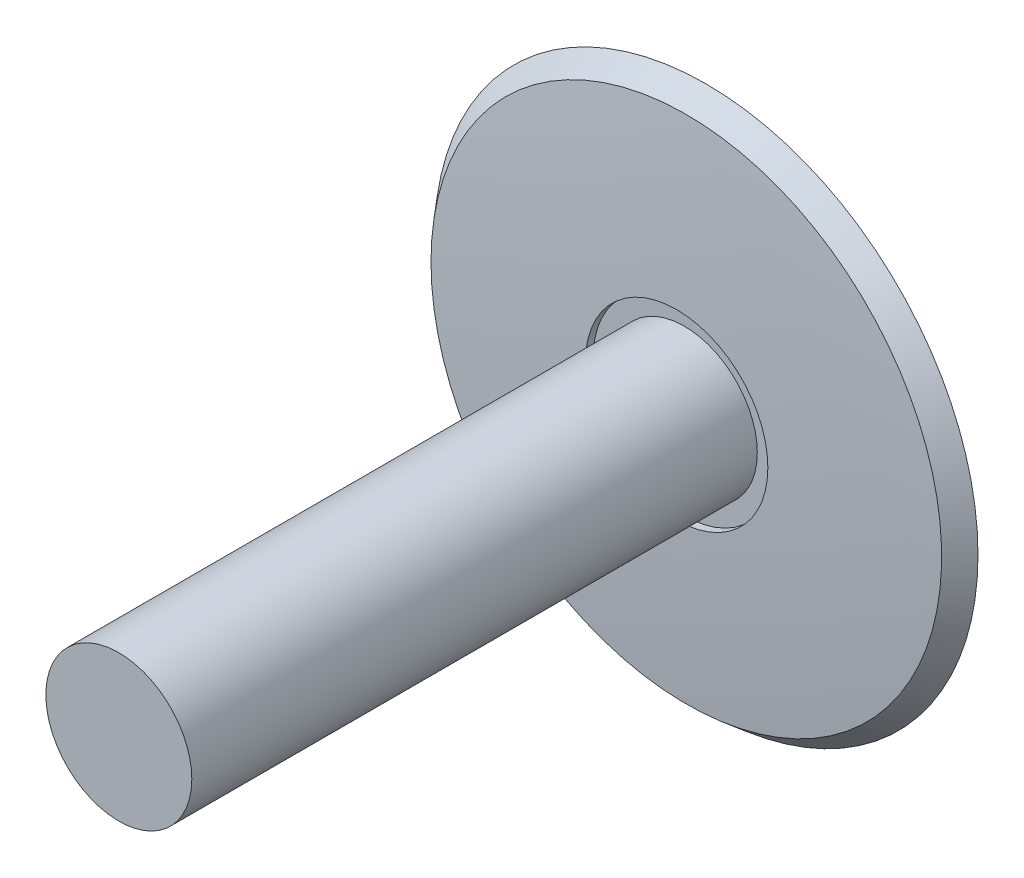
ISO-10303-21;
HEADER;
FILE_DESCRIPTION(('STEP AP214'),'2;1');
FILE_NAME('part.step','',(''),(''),'','','');
FILE_SCHEMA(('AUTOMOTIVE_DESIGN { 1 0 10303 214 1 1 1 1 }'));
ENDSEC;
DATA;
#1=APPLICATION_CONTEXT('core data for automotive mechanical design processes');
#2=APPLICATION_PROTOCOL_DEFINITION('international standard','automotive_design',2000,#1);
#3=PRODUCT_CONTEXT('',#1,'mechanical');
#4=PRODUCT('Part','Part','',(#3));
#5=PRODUCT_RELATED_PRODUCT_CATEGORY('part','',(#4));
#6=PRODUCT_DEFINITION_FORMATION('','',#4);
#7=PRODUCT_DEFINITION_CONTEXT('part definition',#1,'design');
#8=PRODUCT_DEFINITION('design','',#6,#7);
#9=PRODUCT_DEFINITION_SHAPE('','',#8);
#10=(LENGTH_UNIT() NAMED_UNIT(*) SI_UNIT(.MILLI.,.METRE.));
#11=(NAMED_UNIT(*) PLANE_ANGLE_UNIT() SI_UNIT($,.RADIAN.));
#12=(NAMED_UNIT(*) SI_UNIT($,.STERADIAN.) SOLID_ANGLE_UNIT());
#13=UNCERTAINTY_MEASURE_WITH_UNIT(LENGTH_MEASURE(1.E-05),#10,'distance_accuracy_value','');
#14=(GEOMETRIC_REPRESENTATION_CONTEXT(3) GLOBAL_UNCERTAINTY_ASSIGNED_CONTEXT((#13)) GLOBAL_UNIT_ASSIGNED_CONTEXT((#10,
#11,#12)) REPRESENTATION_CONTEXT('',''));
#15=CARTESIAN_POINT('',(0.,0.,0.));
#16=DIRECTION('',(0.,0.,1.));
#17=DIRECTION('',(1.,0.,0.));
#18=AXIS2_PLACEMENT_3D('',#15,#16,#17);
#19=CARTESIAN_POINT('',(3.91391813648032E-08,0.,20.));
#20=CARTESIAN_POINT('',(167.708333370685,0.,19.9999999979615));
#21=CARTESIAN_POINT('',(335.416219398897,0.,6.89638414655821));
#22=CARTESIAN_POINT('',(670.758855879586,0.,-45.5009028070671));
#23=CARTESIAN_POINT('',(838.393039652775,0.,-84.7940066222133));
#24=CARTESIAN_POINT('',(1173.53796012945,0.,-189.52679427413));
#25=CARTESIAN_POINT('',(1341.0487339692,0.,-254.965847738026));
#26=CARTESIAN_POINT('',(1675.92862112605,0.,-411.940794845196));
#27=CARTESIAN_POINT('',(1843.29810743073,0.,-503.476364313146));
#28=CARTESIAN_POINT('',(2010.59997881771,0.,-608.040033930928));
#29=B_SPLINE_CURVE_WITH_KNOTS('',3,(#19,#20,#21,#22,#23,#24,#25,#26,#27,#28),.UNSPECIFIED.,.F.,
.F.,(4,2,2,2,4),(0.,0.25,0.5,0.75,1.),.UNSPECIFIED.);
#30=CARTESIAN_POINT('',(3.40339827192411E-08,0.,-172.522976804327));
#31=DIRECTION('',(0.,0.,-1.));
#32=AXIS1_PLACEMENT('',#30,#31);
#33=SURFACE_OF_REVOLUTION('',#29,#32);
#34=CARTESIAN_POINT('',(3.40340379367494E-08,0.,7.83109189417136));
#35=DIRECTION('',(0.,0.,-1.));
#36=DIRECTION('',(-1.,0.,0.));
#37=AXIS2_PLACEMENT_3D('',#34,#35,#36);
#38=CIRCLE('',#37,279.937835366692);
#39=CARTESIAN_POINT('',(-279.937835332658,0.,7.83109189417145));
#40=VERTEX_POINT('',#39);
#41=EDGE_CURVE('E13',#40,#40,#38,.F.);
#42=ORIENTED_EDGE('',*,*,#41,.T.);
#43=EDGE_LOOP('',(#42));
#44=FACE_BOUND('',#43,.T.);
#45=CARTESIAN_POINT('',(3.40340411869632E-08,0.,18.4470957546538));
#46=DIRECTION('',(0.,0.,-1.));
#47=DIRECTION('',(-1.,0.,0.));
#48=AXIS2_PLACEMENT_3D('',#45,#46,#47);
#49=CIRCLE('',#48,99.999999965966);
#50=CARTESIAN_POINT('',(-99.9999999319319,0.,18.4470957546538));
#51=VERTEX_POINT('',#50);
#52=EDGE_CURVE('E89',#51,#51,#49,.T.);
#53=ORIENTED_EDGE('',*,*,#52,.T.);
#54=EDGE_LOOP('',(#53));
#55=FACE_BOUND('',#54,.T.);
#56=ADVANCED_FACE('F50',(#44,#55),#33,.T.);
#57=CARTESIAN_POINT('',(3.88960808006544E-08,0.,0.));
#58=CARTESIAN_POINT('',(1000.00000002824,0.,-1.21550285032676E-08));
#59=CARTESIAN_POINT('',(2000.00000001758,0.,-625.000000010988));
#60=B_SPLINE_CURVE_WITH_KNOTS('',2,(#57,#58,#59),.UNSPECIFIED.,.F.,.F.,(3,3),
(0.0841011264770974,0.925112391075547),.UNSPECIFIED.);
#61=CARTESIAN_POINT('',(3.40339827192411E-08,0.,-172.522976804327));
#62=DIRECTION('',(0.,0.,-1.));
#63=AXIS1_PLACEMENT('',#61,#62);
#64=SURFACE_OF_REVOLUTION('',#60,#63);
#65=CARTESIAN_POINT('',(3.40340312888634E-08,0.,-13.8825514462477));
#66=DIRECTION('',(0.,0.,-1.));
#67=DIRECTION('',(-1.,0.,0.));
#68=AXIS2_PLACEMENT_3D('',#65,#66,#67);
#69=CIRCLE('',#68,298.074368632555);
#70=CARTESIAN_POINT('',(-298.074368598521,0.,-13.8825514462476));
#71=VERTEX_POINT('',#70);
#72=EDGE_CURVE('E58',#71,#71,#69,.T.);
#73=ORIENTED_EDGE('',*,*,#72,.T.);
#74=EDGE_LOOP('',(#73));
#75=FACE_BOUND('',#74,.T.);
#76=CARTESIAN_POINT('',(3.88960808006544E-08,0.,0.));
#77=VERTEX_POINT('',#76);
#78=VERTEX_LOOP('',#77);
#79=FACE_BOUND('',#78,.T.);
#80=ADVANCED_FACE('F61',(#75,#79),#64,.F.);
#81=CARTESIAN_POINT('',(0.,0.,10.));
#82=DIRECTION('',(0.,0.,1.));
#83=DIRECTION('',(1.,0.,0.));
#84=AXIS2_PLACEMENT_3D('',#81,#82,#83);
#85=CYLINDRICAL_SURFACE('',#84,100.);
#86=CARTESIAN_POINT('',(0.,0.,10.));
#87=DIRECTION('',(0.,0.,1.));
#88=DIRECTION('',(1.,0.,0.));
#89=AXIS2_PLACEMENT_3D('',#86,#87,#88);
#90=CIRCLE('',#89,100.);
#91=CARTESIAN_POINT('',(100.,0.,10.));
#92=VERTEX_POINT('',#91);
#93=EDGE_CURVE('E95',#92,#92,#90,.T.);
#94=ORIENTED_EDGE('',*,*,#93,.F.);
#95=EDGE_LOOP('',(#94));
#96=FACE_BOUND('',#95,.T.);
#97=ORIENTED_EDGE('',*,*,#52,.F.);
#98=EDGE_LOOP('',(#97));
#99=FACE_BOUND('',#98,.T.);
#100=ADVANCED_FACE('F63',(#96,#99),#85,.F.);
#101=CARTESIAN_POINT('',(0.,0.,10.));
#102=DIRECTION('',(0.,0.,1.));
#103=DIRECTION('',(1.,0.,0.));
#104=AXIS2_PLACEMENT_3D('',#101,#102,#103);
#105=PLANE('',#104);
#106=CARTESIAN_POINT('',(0.,0.,10.));
#107=DIRECTION('',(0.,0.,1.));
#108=DIRECTION('',(1.,0.,0.));
#109=AXIS2_PLACEMENT_3D('',#106,#107,#108);
#110=CIRCLE('',#109,80.0000000316024);
#111=CARTESIAN_POINT('',(80.0000000316024,0.,10.));
#112=VERTEX_POINT('',#111);
#113=EDGE_CURVE('E103',#112,#112,#110,.T.);
#114=ORIENTED_EDGE('',*,*,#113,.F.);
#115=EDGE_LOOP('',(#114));
#116=FACE_BOUND('',#115,.T.);
#117=ORIENTED_EDGE('',*,*,#93,.T.);
#118=EDGE_LOOP('',(#117));
#119=FACE_BOUND('',#118,.T.);
#120=ADVANCED_FACE('F71',(#116,#119),#105,.T.);
#121=CARTESIAN_POINT('',(3.40340373836131E-08,0.,630.));
#122=DIRECTION('',(0.,0.,1.));
#123=DIRECTION('',(1.,0.,0.));
#124=AXIS2_PLACEMENT_3D('',#121,#122,#123);
#125=PLANE('',#124);
#126=CARTESIAN_POINT('',(3.40340373836131E-08,0.,630.));
#127=DIRECTION('',(0.,0.,1.));
#128=DIRECTION('',(1.,0.,0.));
#129=AXIS2_PLACEMENT_3D('',#126,#127,#128);
#130=CIRCLE('',#129,80.);
#131=CARTESIAN_POINT('',(80.000000034034,0.,630.));
#132=VERTEX_POINT('',#131);
#133=EDGE_CURVE('E94',#132,#132,#130,.T.);
#134=ORIENTED_EDGE('',*,*,#133,.T.);
#135=EDGE_LOOP('',(#134));
#136=FACE_BOUND('',#135,.T.);
#137=ADVANCED_FACE('F110',(#136),#125,.T.);
#138=CARTESIAN_POINT('',(3.40340373836131E-08,0.,630.));
#139=DIRECTION('',(0.,0.,-1.));
#140=DIRECTION('',(-1.,0.,0.));
#141=AXIS2_PLACEMENT_3D('',#138,#139,#140);
#142=CYLINDRICAL_SURFACE('',#141,80.);
#143=ORIENTED_EDGE('',*,*,#133,.F.);
#144=EDGE_LOOP('',(#143));
#145=FACE_BOUND('',#144,.T.);
#146=ORIENTED_EDGE('',*,*,#113,.T.);
#147=EDGE_LOOP('',(#146));
#148=FACE_BOUND('',#147,.T.);
#149=ADVANCED_FACE('F78',(#145,#148),#142,.T.);
#150=CARTESIAN_POINT('',(3.40340305830297E-08,0.,-16.1879794575016));
#151=DIRECTION('',(0.,0.,-1.));
#152=DIRECTION('',(-1.,0.,0.));
#153=AXIS2_PLACEMENT_3D('',#150,#151,#152);
#154=CONICAL_SURFACE('',#153,299.999999965966,0.695874129118447);
#155=ORIENTED_EDGE('',*,*,#41,.F.);
#156=EDGE_LOOP('',(#155));
#157=FACE_BOUND('',#156,.T.);
#158=ORIENTED_EDGE('',*,*,#72,.F.);
#159=EDGE_LOOP('',(#158));
#160=FACE_BOUND('',#159,.T.);
#161=ADVANCED_FACE('F53',(#157,#160),#154,.T.);
#162=CLOSED_SHELL('',(#56,#80,#100,#120,#137,#149,#161));
#163=MANIFOLD_SOLID_BREP('B2',#162);
#164=ADVANCED_BREP_SHAPE_REPRESENTATION('',(#18,#163),#14);
#165=SHAPE_DEFINITION_REPRESENTATION(#9,#164);
ENDSEC;
END-ISO-10303-21;
